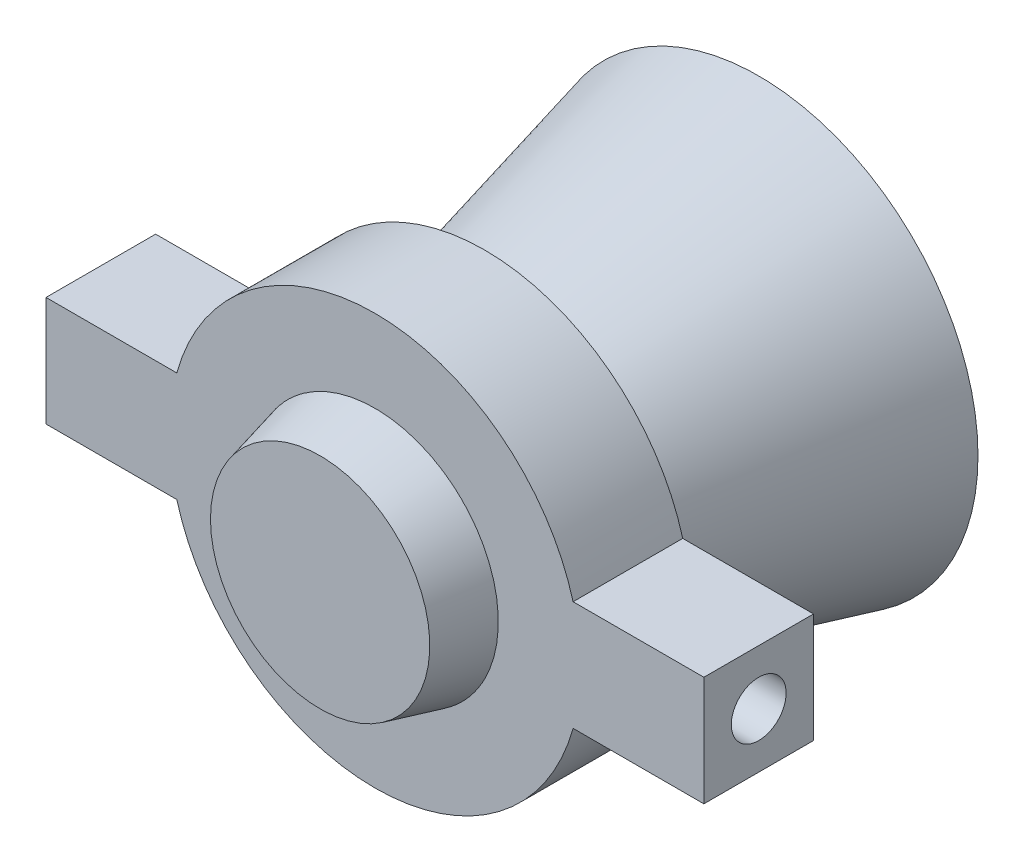
ISO-10303-21;
HEADER;
FILE_DESCRIPTION(('STEP AP214'),'2;1');
FILE_NAME('part.step','',(''),(''),'','','');
FILE_SCHEMA(('AUTOMOTIVE_DESIGN { 1 0 10303 214 1 1 1 1 }'));
ENDSEC;
DATA;
#1=APPLICATION_CONTEXT('core data for automotive mechanical design processes');
#2=APPLICATION_PROTOCOL_DEFINITION('international standard','automotive_design',2000,#1);
#3=PRODUCT_CONTEXT('',#1,'mechanical');
#4=PRODUCT('Part','Part','',(#3));
#5=PRODUCT_RELATED_PRODUCT_CATEGORY('part','',(#4));
#6=PRODUCT_DEFINITION_FORMATION('','',#4);
#7=PRODUCT_DEFINITION_CONTEXT('part definition',#1,'design');
#8=PRODUCT_DEFINITION('design','',#6,#7);
#9=PRODUCT_DEFINITION_SHAPE('','',#8);
#10=(LENGTH_UNIT() NAMED_UNIT(*) SI_UNIT(.MILLI.,.METRE.));
#11=(NAMED_UNIT(*) PLANE_ANGLE_UNIT() SI_UNIT($,.RADIAN.));
#12=(NAMED_UNIT(*) SI_UNIT($,.STERADIAN.) SOLID_ANGLE_UNIT());
#13=UNCERTAINTY_MEASURE_WITH_UNIT(LENGTH_MEASURE(1.E-05),#10,'distance_accuracy_value','');
#14=(GEOMETRIC_REPRESENTATION_CONTEXT(3) GLOBAL_UNCERTAINTY_ASSIGNED_CONTEXT((#13)) GLOBAL_UNIT_ASSIGNED_CONTEXT((#10,
#11,#12)) REPRESENTATION_CONTEXT('',''));
#15=CARTESIAN_POINT('',(0.,0.,0.));
#16=DIRECTION('',(0.,0.,1.));
#17=DIRECTION('',(1.,0.,0.));
#18=AXIS2_PLACEMENT_3D('',#15,#16,#17);
#19=CARTESIAN_POINT('',(0.,0.,0.));
#20=DIRECTION('',(0.,0.,-1.));
#21=DIRECTION('',(-1.,0.,0.));
#22=AXIS2_PLACEMENT_3D('',#19,#20,#21);
#23=CYLINDRICAL_SURFACE('',#22,23.8125);
#24=CARTESIAN_POINT('',(0.,0.,44.45));
#25=DIRECTION('',(0.,0.,-1.));
#26=DIRECTION('',(-1.,0.,0.));
#27=AXIS2_PLACEMENT_3D('',#24,#25,#26);
#28=CIRCLE('',#27,23.8125);
#29=CARTESIAN_POINT('',(22.9502212679965,-6.35,44.45));
#30=VERTEX_POINT('',#29);
#31=CARTESIAN_POINT('',(-22.9502212679965,-6.35,44.45));
#32=VERTEX_POINT('',#31);
#33=EDGE_CURVE('E12',#30,#32,#28,.T.);
#34=ORIENTED_EDGE('',*,*,#33,.T.);
#35=DIRECTION('',(0.,0.,-1.));
#36=VECTOR('',#35,1.);
#37=CARTESIAN_POINT('',(-22.9502212679965,-6.35,0.));
#38=LINE('',#37,#36);
#39=CARTESIAN_POINT('',(-22.9502212679965,-6.35,31.75));
#40=VERTEX_POINT('',#39);
#41=EDGE_CURVE('E112',#32,#40,#38,.T.);
#42=ORIENTED_EDGE('',*,*,#41,.T.);
#43=CARTESIAN_POINT('',(0.,0.,31.75));
#44=DIRECTION('',(0.,0.,-1.));
#45=DIRECTION('',(-1.,0.,0.));
#46=AXIS2_PLACEMENT_3D('',#43,#44,#45);
#47=CIRCLE('',#46,23.8125);
#48=CARTESIAN_POINT('',(22.9502212679965,-6.35,31.75));
#49=VERTEX_POINT('',#48);
#50=EDGE_CURVE('E121',#49,#40,#47,.T.);
#51=ORIENTED_EDGE('',*,*,#50,.F.);
#52=DIRECTION('',(0.,0.,-1.));
#53=VECTOR('',#52,1.);
#54=CARTESIAN_POINT('',(22.9502212679965,-6.35,0.));
#55=LINE('',#54,#53);
#56=EDGE_CURVE('E66',#30,#49,#55,.T.);
#57=ORIENTED_EDGE('',*,*,#56,.F.);
#58=EDGE_LOOP('',(#34,#42,#51,#57));
#59=FACE_BOUND('',#58,.T.);
#60=ADVANCED_FACE('F50',(#59),#23,.T.);
#61=CARTESIAN_POINT('',(-22.9502212679965,6.35,31.75));
#62=VERTEX_POINT('',#61);
#63=CARTESIAN_POINT('',(22.9502212679965,6.35,31.75));
#64=VERTEX_POINT('',#63);
#65=EDGE_CURVE('E135',#62,#64,#47,.T.);
#66=ORIENTED_EDGE('',*,*,#65,.F.);
#67=DIRECTION('',(0.,0.,-1.));
#68=VECTOR('',#67,1.);
#69=CARTESIAN_POINT('',(-22.9502212679965,6.35,0.));
#70=LINE('',#69,#68);
#71=CARTESIAN_POINT('',(-22.9502212679965,6.35,44.45));
#72=VERTEX_POINT('',#71);
#73=EDGE_CURVE('E123',#62,#72,#70,.F.);
#74=ORIENTED_EDGE('',*,*,#73,.T.);
#75=CARTESIAN_POINT('',(22.9502212679965,6.35,44.45));
#76=VERTEX_POINT('',#75);
#77=EDGE_CURVE('E54',#72,#76,#28,.T.);
#78=ORIENTED_EDGE('',*,*,#77,.T.);
#79=DIRECTION('',(0.,0.,-1.));
#80=VECTOR('',#79,1.);
#81=CARTESIAN_POINT('',(22.9502212679965,6.35,0.));
#82=LINE('',#81,#80);
#83=EDGE_CURVE('E147',#64,#76,#82,.F.);
#84=ORIENTED_EDGE('',*,*,#83,.F.);
#85=EDGE_LOOP('',(#66,#74,#78,#84));
#86=FACE_BOUND('',#85,.T.);
#87=ADVANCED_FACE('F198',(#86),#23,.T.);
#88=CARTESIAN_POINT('',(0.,-23.8125,44.45));
#89=DIRECTION('',(0.,0.,-1.));
#90=DIRECTION('',(-1.,0.,0.));
#91=AXIS2_PLACEMENT_3D('',#88,#89,#90);
#92=PLANE('',#91);
#93=ORIENTED_EDGE('',*,*,#33,.F.);
#94=DIRECTION('',(1.,0.,0.));
#95=VECTOR('',#94,1.);
#96=CARTESIAN_POINT('',(-25.401,-6.35,44.45));
#97=LINE('',#96,#95);
#98=CARTESIAN_POINT('',(38.1,-6.35,44.45));
#99=VERTEX_POINT('',#98);
#100=EDGE_CURVE('E150',#30,#99,#97,.T.);
#101=ORIENTED_EDGE('',*,*,#100,.T.);
#102=DIRECTION('',(0.,-1.,0.));
#103=VECTOR('',#102,1.);
#104=CARTESIAN_POINT('',(38.1,-6.35,44.45));
#105=LINE('',#104,#103);
#106=CARTESIAN_POINT('',(38.1,6.35,44.45));
#107=VERTEX_POINT('',#106);
#108=EDGE_CURVE('E138',#107,#99,#105,.T.);
#109=ORIENTED_EDGE('',*,*,#108,.F.);
#110=DIRECTION('',(1.,0.,0.));
#111=VECTOR('',#110,1.);
#112=CARTESIAN_POINT('',(-25.401,6.35,44.45));
#113=LINE('',#112,#111);
#114=EDGE_CURVE('E144',#76,#107,#113,.T.);
#115=ORIENTED_EDGE('',*,*,#114,.F.);
#116=ORIENTED_EDGE('',*,*,#77,.F.);
#117=DIRECTION('',(-1.,0.,0.));
#118=VECTOR('',#117,1.);
#119=CARTESIAN_POINT('',(38.101,6.35,44.45));
#120=LINE('',#119,#118);
#121=CARTESIAN_POINT('',(-38.1,6.35,44.45));
#122=VERTEX_POINT('',#121);
#123=EDGE_CURVE('E65',#72,#122,#120,.T.);
#124=ORIENTED_EDGE('',*,*,#123,.T.);
#125=DIRECTION('',(0.,-1.,0.));
#126=VECTOR('',#125,1.);
#127=CARTESIAN_POINT('',(-38.1,-6.35,44.45));
#128=LINE('',#127,#126);
#129=CARTESIAN_POINT('',(-38.1,-6.35,44.45));
#130=VERTEX_POINT('',#129);
#131=EDGE_CURVE('E127',#122,#130,#128,.T.);
#132=ORIENTED_EDGE('',*,*,#131,.T.);
#133=DIRECTION('',(-1.,0.,0.));
#134=VECTOR('',#133,1.);
#135=CARTESIAN_POINT('',(38.101,-6.35,44.45));
#136=LINE('',#135,#134);
#137=EDGE_CURVE('E167',#32,#130,#136,.T.);
#138=ORIENTED_EDGE('',*,*,#137,.F.);
#139=EDGE_LOOP('',(#93,#101,#109,#115,#116,#124,#132,#138));
#140=FACE_BOUND('',#139,.T.);
#141=CARTESIAN_POINT('',(0.,0.,44.45));
#142=DIRECTION('',(0.,0.,-1.));
#143=DIRECTION('',(-1.,0.,0.));
#144=AXIS2_PLACEMENT_3D('',#141,#142,#143);
#145=CIRCLE('',#144,14.2875);
#146=CARTESIAN_POINT('',(-14.2875,0.,44.45));
#147=VERTEX_POINT('',#146);
#148=EDGE_CURVE('E140',#147,#147,#145,.T.);
#149=ORIENTED_EDGE('',*,*,#148,.T.);
#150=EDGE_LOOP('',(#149));
#151=FACE_BOUND('',#150,.T.);
#152=ADVANCED_FACE('F47',(#140,#151),#92,.F.);
#153=CARTESIAN_POINT('',(0.,-17.4625,31.75));
#154=DIRECTION('',(0.,0.,1.));
#155=DIRECTION('',(1.,0.,0.));
#156=AXIS2_PLACEMENT_3D('',#153,#154,#155);
#157=PLANE('',#156);
#158=CARTESIAN_POINT('',(0.,0.,31.75));
#159=DIRECTION('',(0.,0.,-1.));
#160=DIRECTION('',(-1.,0.,0.));
#161=AXIS2_PLACEMENT_3D('',#158,#159,#160);
#162=CIRCLE('',#161,17.4625);
#163=CARTESIAN_POINT('',(-17.4625,0.,31.75));
#164=VERTEX_POINT('',#163);
#165=EDGE_CURVE('E134',#164,#164,#162,.T.);
#166=ORIENTED_EDGE('',*,*,#165,.F.);
#167=EDGE_LOOP('',(#166));
#168=FACE_BOUND('',#167,.T.);
#169=ORIENTED_EDGE('',*,*,#50,.T.);
#170=DIRECTION('',(-1.,0.,0.));
#171=VECTOR('',#170,1.);
#172=CARTESIAN_POINT('',(38.101,-6.35,31.75));
#173=LINE('',#172,#171);
#174=CARTESIAN_POINT('',(-38.1,-6.35,31.75));
#175=VERTEX_POINT('',#174);
#176=EDGE_CURVE('E111',#40,#175,#173,.T.);
#177=ORIENTED_EDGE('',*,*,#176,.T.);
#178=DIRECTION('',(0.,1.,0.));
#179=VECTOR('',#178,1.);
#180=CARTESIAN_POINT('',(-38.1,-6.35,31.75));
#181=LINE('',#180,#179);
#182=CARTESIAN_POINT('',(-38.1,6.35,31.75));
#183=VERTEX_POINT('',#182);
#184=EDGE_CURVE('E125',#175,#183,#181,.T.);
#185=ORIENTED_EDGE('',*,*,#184,.T.);
#186=DIRECTION('',(-1.,0.,0.));
#187=VECTOR('',#186,1.);
#188=CARTESIAN_POINT('',(38.101,6.35,31.75));
#189=LINE('',#188,#187);
#190=EDGE_CURVE('E174',#62,#183,#189,.T.);
#191=ORIENTED_EDGE('',*,*,#190,.F.);
#192=ORIENTED_EDGE('',*,*,#65,.T.);
#193=DIRECTION('',(1.,0.,0.));
#194=VECTOR('',#193,1.);
#195=CARTESIAN_POINT('',(-25.401,6.35,31.75));
#196=LINE('',#195,#194);
#197=CARTESIAN_POINT('',(38.1,6.35,31.75));
#198=VERTEX_POINT('',#197);
#199=EDGE_CURVE('E142',#64,#198,#196,.T.);
#200=ORIENTED_EDGE('',*,*,#199,.T.);
#201=DIRECTION('',(0.,1.,0.));
#202=VECTOR('',#201,1.);
#203=CARTESIAN_POINT('',(38.1,-6.35,31.75));
#204=LINE('',#203,#202);
#205=CARTESIAN_POINT('',(38.1,-6.35,31.75));
#206=VERTEX_POINT('',#205);
#207=EDGE_CURVE('E157',#206,#198,#204,.T.);
#208=ORIENTED_EDGE('',*,*,#207,.F.);
#209=DIRECTION('',(1.,0.,0.));
#210=VECTOR('',#209,1.);
#211=CARTESIAN_POINT('',(-25.401,-6.35,31.75));
#212=LINE('',#211,#210);
#213=EDGE_CURVE('E132',#49,#206,#212,.T.);
#214=ORIENTED_EDGE('',*,*,#213,.F.);
#215=EDGE_LOOP('',(#169,#177,#185,#191,#192,#200,#208,#214));
#216=FACE_BOUND('',#215,.T.);
#217=ADVANCED_FACE('F126',(#168,#216),#157,.F.);
#218=CARTESIAN_POINT('',(0.,0.,31.75));
#219=DIRECTION('',(0.,0.,-1.));
#220=DIRECTION('',(-1.,0.,0.));
#221=AXIS2_PLACEMENT_3D('',#218,#219,#220);
#222=CONICAL_SURFACE('',#221,17.4625,0.244978663126864);
#223=ORIENTED_EDGE('',*,*,#148,.F.);
#224=EDGE_LOOP('',(#223));
#225=FACE_BOUND('',#224,.T.);
#226=ORIENTED_EDGE('',*,*,#165,.T.);
#227=EDGE_LOOP('',(#226));
#228=FACE_BOUND('',#227,.T.);
#229=ADVANCED_FACE('F209',(#225,#228),#222,.F.);
#230=CARTESIAN_POINT('',(-25.401,-6.35,44.45));
#231=DIRECTION('',(0.,-1.,0.));
#232=DIRECTION('',(0.,0.,-1.));
#233=AXIS2_PLACEMENT_3D('',#230,#231,#232);
#234=PLANE('',#233);
#235=ORIENTED_EDGE('',*,*,#100,.F.);
#236=ORIENTED_EDGE('',*,*,#56,.T.);
#237=ORIENTED_EDGE('',*,*,#213,.T.);
#238=DIRECTION('',(0.,0.,-1.));
#239=VECTOR('',#238,1.);
#240=CARTESIAN_POINT('',(38.1,-6.35,44.45));
#241=LINE('',#240,#239);
#242=EDGE_CURVE('E141',#99,#206,#241,.T.);
#243=ORIENTED_EDGE('',*,*,#242,.F.);
#244=EDGE_LOOP('',(#235,#236,#237,#243));
#245=FACE_BOUND('',#244,.T.);
#246=ADVANCED_FACE('F214',(#245),#234,.T.);
#247=CARTESIAN_POINT('',(-25.401,6.35,44.45));
#248=DIRECTION('',(0.,1.,0.));
#249=DIRECTION('',(0.,0.,1.));
#250=AXIS2_PLACEMENT_3D('',#247,#248,#249);
#251=PLANE('',#250);
#252=ORIENTED_EDGE('',*,*,#199,.F.);
#253=ORIENTED_EDGE('',*,*,#83,.T.);
#254=ORIENTED_EDGE('',*,*,#114,.T.);
#255=DIRECTION('',(0.,0.,1.));
#256=VECTOR('',#255,1.);
#257=CARTESIAN_POINT('',(38.1,6.35,44.45));
#258=LINE('',#257,#256);
#259=EDGE_CURVE('E156',#198,#107,#258,.T.);
#260=ORIENTED_EDGE('',*,*,#259,.F.);
#261=EDGE_LOOP('',(#252,#253,#254,#260));
#262=FACE_BOUND('',#261,.T.);
#263=ADVANCED_FACE('F220',(#262),#251,.T.);
#264=CARTESIAN_POINT('',(38.1,0.,0.));
#265=DIRECTION('',(1.,0.,0.));
#266=DIRECTION('',(0.,0.,-1.));
#267=AXIS2_PLACEMENT_3D('',#264,#265,#266);
#268=PLANE('',#267);
#269=CARTESIAN_POINT('',(38.1,0.,38.1));
#270=DIRECTION('',(1.,0.,0.));
#271=DIRECTION('',(0.,0.,-1.));
#272=AXIS2_PLACEMENT_3D('',#269,#270,#271);
#273=CIRCLE('',#272,3.175);
#274=CARTESIAN_POINT('',(38.1,0.,34.925));
#275=VERTEX_POINT('',#274);
#276=EDGE_CURVE('E165',#275,#275,#273,.T.);
#277=ORIENTED_EDGE('',*,*,#276,.F.);
#278=EDGE_LOOP('',(#277));
#279=FACE_BOUND('',#278,.T.);
#280=ORIENTED_EDGE('',*,*,#242,.T.);
#281=ORIENTED_EDGE('',*,*,#207,.T.);
#282=ORIENTED_EDGE('',*,*,#259,.T.);
#283=ORIENTED_EDGE('',*,*,#108,.T.);
#284=EDGE_LOOP('',(#280,#281,#282,#283));
#285=FACE_BOUND('',#284,.T.);
#286=ADVANCED_FACE('F222',(#279,#285),#268,.T.);
#287=CARTESIAN_POINT('',(19.05,0.,38.1));
#288=DIRECTION('',(1.,0.,0.));
#289=DIRECTION('',(0.,0.,-1.));
#290=AXIS2_PLACEMENT_3D('',#287,#288,#289);
#291=CYLINDRICAL_SURFACE('',#290,3.175);
#292=CARTESIAN_POINT('',(19.05,0.,38.1));
#293=DIRECTION('',(1.,0.,0.));
#294=DIRECTION('',(0.,0.,-1.));
#295=AXIS2_PLACEMENT_3D('',#292,#293,#294);
#296=CIRCLE('',#295,3.175);
#297=CARTESIAN_POINT('',(19.05,0.,34.925));
#298=VERTEX_POINT('',#297);
#299=EDGE_CURVE('E154',#298,#298,#296,.T.);
#300=CARTESIAN_POINT('',(19.05,0.,34.925));
#301=CARTESIAN_POINT('',(19.2484375,0.,34.925));
#302=CARTESIAN_POINT('',(19.446875,0.,34.925));
#303=CARTESIAN_POINT('',(19.84375,0.,34.925));
#304=CARTESIAN_POINT('',(20.0421875,0.,34.925));
#305=CARTESIAN_POINT('',(20.4390625,0.,34.925));
#306=CARTESIAN_POINT('',(20.6375,0.,34.925));
#307=CARTESIAN_POINT('',(21.034375,0.,34.925));
#308=CARTESIAN_POINT('',(21.2328125,0.,34.925));
#309=CARTESIAN_POINT('',(21.6296875,0.,34.925));
#310=CARTESIAN_POINT('',(21.828125,0.,34.925));
#311=CARTESIAN_POINT('',(22.225,0.,34.925));
#312=CARTESIAN_POINT('',(22.4234375,0.,34.925));
#313=CARTESIAN_POINT('',(22.8203125,0.,34.925));
#314=CARTESIAN_POINT('',(23.01875,0.,34.925));
#315=CARTESIAN_POINT('',(23.415625,0.,34.925));
#316=CARTESIAN_POINT('',(23.6140625,0.,34.925));
#317=CARTESIAN_POINT('',(24.0109375,0.,34.925));
#318=CARTESIAN_POINT('',(24.209375,0.,34.925));
#319=CARTESIAN_POINT('',(24.60625,0.,34.925));
#320=CARTESIAN_POINT('',(24.8046875,0.,34.925));
#321=CARTESIAN_POINT('',(25.2015625,0.,34.925));
#322=CARTESIAN_POINT('',(25.4,0.,34.925));
#323=CARTESIAN_POINT('',(25.796875,0.,34.925));
#324=CARTESIAN_POINT('',(25.9953125,0.,34.925));
#325=CARTESIAN_POINT('',(26.3921875,0.,34.925));
#326=CARTESIAN_POINT('',(26.590625,0.,34.925));
#327=CARTESIAN_POINT('',(26.9875,0.,34.925));
#328=CARTESIAN_POINT('',(27.1859375,0.,34.925));
#329=CARTESIAN_POINT('',(27.5828125,0.,34.925));
#330=CARTESIAN_POINT('',(27.78125,0.,34.925));
#331=CARTESIAN_POINT('',(28.178125,0.,34.925));
#332=CARTESIAN_POINT('',(28.3765625,0.,34.925));
#333=CARTESIAN_POINT('',(28.7734375,0.,34.925));
#334=CARTESIAN_POINT('',(28.971875,0.,34.925));
#335=CARTESIAN_POINT('',(29.36875,0.,34.925));
#336=CARTESIAN_POINT('',(29.5671875,0.,34.925));
#337=CARTESIAN_POINT('',(29.9640625,0.,34.925));
#338=CARTESIAN_POINT('',(30.1625,0.,34.925));
#339=CARTESIAN_POINT('',(30.559375,0.,34.925));
#340=CARTESIAN_POINT('',(30.7578125,0.,34.925));
#341=CARTESIAN_POINT('',(31.1546875,0.,34.925));
#342=CARTESIAN_POINT('',(31.353125,0.,34.925));
#343=CARTESIAN_POINT('',(31.75,0.,34.925));
#344=CARTESIAN_POINT('',(31.9484375,0.,34.925));
#345=CARTESIAN_POINT('',(32.3453125,0.,34.925));
#346=CARTESIAN_POINT('',(32.54375,0.,34.925));
#347=CARTESIAN_POINT('',(32.940625,0.,34.925));
#348=CARTESIAN_POINT('',(33.1390625,0.,34.925));
#349=CARTESIAN_POINT('',(33.5359375,0.,34.925));
#350=CARTESIAN_POINT('',(33.734375,0.,34.925));
#351=CARTESIAN_POINT('',(34.13125,0.,34.925));
#352=CARTESIAN_POINT('',(34.3296875,0.,34.925));
#353=CARTESIAN_POINT('',(34.7265625,0.,34.925));
#354=CARTESIAN_POINT('',(34.925,0.,34.925));
#355=CARTESIAN_POINT('',(35.321875,0.,34.925));
#356=CARTESIAN_POINT('',(35.5203125,0.,34.925));
#357=CARTESIAN_POINT('',(35.9171875,0.,34.925));
#358=CARTESIAN_POINT('',(36.115625,0.,34.925));
#359=CARTESIAN_POINT('',(36.5125,0.,34.925));
#360=CARTESIAN_POINT('',(36.7109375,0.,34.925));
#361=CARTESIAN_POINT('',(37.1078125,0.,34.925));
#362=CARTESIAN_POINT('',(37.30625,0.,34.925));
#363=CARTESIAN_POINT('',(37.703125,0.,34.925));
#364=CARTESIAN_POINT('',(37.9015625,0.,34.925));
#365=CARTESIAN_POINT('',(38.1,0.,34.925));
#366=B_SPLINE_CURVE_WITH_KNOTS('',3,(#300,#301,#302,#303,#304,#305,#306,#307,#308,#309,#310,
#311,#312,#313,#314,#315,#316,#317,#318,#319,#320,#321,#322,#323,#324,#325,#326,#327,#328,#329,
#330,#331,#332,#333,#334,#335,#336,#337,#338,#339,#340,#341,#342,#343,#344,#345,#346,#347,#348,
#349,#350,#351,#352,#353,#354,#355,#356,#357,#358,#359,#360,#361,#362,#363,#364,#365),
.UNSPECIFIED.,.F.,.F.,(4,2,2,2,2,2,2,2,2,2,2,2,2,2,2,2,2,2,2,2,2,2,2,2,2,2,2,2,2,2,2,2,4),(0.,
0.5953125,1.190625,1.7859375,2.38125,2.9765625,3.571875,4.1671875,4.7625,5.3578125,5.953125,
6.5484375,7.14375,7.7390625,8.334375,8.92968750000001,9.52500000000001,10.1203125,10.715625,
11.3109375,11.90625,12.5015625,13.096875,13.6921875,14.2875,14.8828125,15.478125,16.0734375,
16.66875,17.2640625,17.859375,18.4546875,19.05),.UNSPECIFIED.);
#367=EDGE_CURVE('BSEAM223',#298,#275,#366,.T.);
#368=ORIENTED_EDGE('',*,*,#299,.F.);
#369=ORIENTED_EDGE('',*,*,#276,.T.);
#370=ORIENTED_EDGE('',*,*,#367,.T.);
#371=ORIENTED_EDGE('',*,*,#367,.F.);
#372=EDGE_LOOP('',(#368,#370,#369,#371));
#373=FACE_BOUND('',#372,.T.);
#374=ADVANCED_FACE('F223',(#373),#291,.F.);
#375=CARTESIAN_POINT('',(19.05,0.,38.1));
#376=DIRECTION('',(1.,0.,0.));
#377=DIRECTION('',(0.,0.,-1.));
#378=AXIS2_PLACEMENT_3D('',#375,#376,#377);
#379=PLANE('',#378);
#380=ORIENTED_EDGE('',*,*,#299,.T.);
#381=EDGE_LOOP('',(#380));
#382=FACE_BOUND('',#381,.T.);
#383=ADVANCED_FACE('F230',(#382),#379,.T.);
#384=CARTESIAN_POINT('',(38.101,-6.35,44.45));
#385=DIRECTION('',(0.,1.,0.));
#386=DIRECTION('',(0.,0.,1.));
#387=AXIS2_PLACEMENT_3D('',#384,#385,#386);
#388=PLANE('',#387);
#389=ORIENTED_EDGE('',*,*,#41,.F.);
#390=ORIENTED_EDGE('',*,*,#137,.T.);
#391=DIRECTION('',(0.,0.,-1.));
#392=VECTOR('',#391,1.);
#393=CARTESIAN_POINT('',(-38.1,-6.35,44.45));
#394=LINE('',#393,#392);
#395=EDGE_CURVE('E120',#130,#175,#394,.T.);
#396=ORIENTED_EDGE('',*,*,#395,.T.);
#397=ORIENTED_EDGE('',*,*,#176,.F.);
#398=EDGE_LOOP('',(#389,#390,#396,#397));
#399=FACE_BOUND('',#398,.T.);
#400=ADVANCED_FACE('F113',(#399),#388,.F.);
#401=CARTESIAN_POINT('',(38.101,6.35,44.45));
#402=DIRECTION('',(0.,-1.,0.));
#403=DIRECTION('',(0.,0.,-1.));
#404=AXIS2_PLACEMENT_3D('',#401,#402,#403);
#405=PLANE('',#404);
#406=ORIENTED_EDGE('',*,*,#73,.F.);
#407=ORIENTED_EDGE('',*,*,#190,.T.);
#408=DIRECTION('',(0.,0.,1.));
#409=VECTOR('',#408,1.);
#410=CARTESIAN_POINT('',(-38.1,6.35,44.45));
#411=LINE('',#410,#409);
#412=EDGE_CURVE('E172',#183,#122,#411,.T.);
#413=ORIENTED_EDGE('',*,*,#412,.T.);
#414=ORIENTED_EDGE('',*,*,#123,.F.);
#415=EDGE_LOOP('',(#406,#407,#413,#414));
#416=FACE_BOUND('',#415,.T.);
#417=ADVANCED_FACE('F232',(#416),#405,.F.);
#418=CARTESIAN_POINT('',(-38.1,0.,0.));
#419=DIRECTION('',(-1.,0.,0.));
#420=DIRECTION('',(0.,0.,-1.));
#421=AXIS2_PLACEMENT_3D('',#418,#419,#420);
#422=PLANE('',#421);
#423=CARTESIAN_POINT('',(-38.1,0.,38.1));
#424=DIRECTION('',(1.,0.,0.));
#425=DIRECTION('',(0.,0.,-1.));
#426=AXIS2_PLACEMENT_3D('',#423,#424,#425);
#427=CIRCLE('',#426,3.175);
#428=CARTESIAN_POINT('',(-38.1,0.,41.275));
#429=VERTEX_POINT('',#428);
#430=EDGE_CURVE('E185',#429,#429,#427,.T.);
#431=ORIENTED_EDGE('',*,*,#430,.T.);
#432=EDGE_LOOP('',(#431));
#433=FACE_BOUND('',#432,.T.);
#434=ORIENTED_EDGE('',*,*,#395,.F.);
#435=ORIENTED_EDGE('',*,*,#131,.F.);
#436=ORIENTED_EDGE('',*,*,#412,.F.);
#437=ORIENTED_EDGE('',*,*,#184,.F.);
#438=EDGE_LOOP('',(#434,#435,#436,#437));
#439=FACE_BOUND('',#438,.T.);
#440=ADVANCED_FACE('F200',(#433,#439),#422,.T.);
#441=CARTESIAN_POINT('',(-19.05,0.,38.1));
#442=DIRECTION('',(-1.,0.,0.));
#443=DIRECTION('',(0.,0.,1.));
#444=AXIS2_PLACEMENT_3D('',#441,#442,#443);
#445=CYLINDRICAL_SURFACE('',#444,3.175);
#446=CARTESIAN_POINT('',(-19.05,0.,38.1));
#447=DIRECTION('',(1.,0.,0.));
#448=DIRECTION('',(0.,0.,-1.));
#449=AXIS2_PLACEMENT_3D('',#446,#447,#448);
#450=CIRCLE('',#449,3.175);
#451=CARTESIAN_POINT('',(-19.05,0.,41.275));
#452=VERTEX_POINT('',#451);
#453=EDGE_CURVE('E175',#452,#452,#450,.T.);
#454=CARTESIAN_POINT('',(-19.05,0.,41.275));
#455=CARTESIAN_POINT('',(-19.2484375,0.,41.275));
#456=CARTESIAN_POINT('',(-19.446875,0.,41.275));
#457=CARTESIAN_POINT('',(-19.84375,0.,41.275));
#458=CARTESIAN_POINT('',(-20.0421875,0.,41.275));
#459=CARTESIAN_POINT('',(-20.4390625,0.,41.275));
#460=CARTESIAN_POINT('',(-20.6375,0.,41.275));
#461=CARTESIAN_POINT('',(-21.034375,0.,41.275));
#462=CARTESIAN_POINT('',(-21.2328125,0.,41.275));
#463=CARTESIAN_POINT('',(-21.6296875,0.,41.275));
#464=CARTESIAN_POINT('',(-21.828125,0.,41.275));
#465=CARTESIAN_POINT('',(-22.225,0.,41.275));
#466=CARTESIAN_POINT('',(-22.4234375,0.,41.275));
#467=CARTESIAN_POINT('',(-22.8203125,0.,41.275));
#468=CARTESIAN_POINT('',(-23.01875,0.,41.275));
#469=CARTESIAN_POINT('',(-23.415625,0.,41.275));
#470=CARTESIAN_POINT('',(-23.6140625,0.,41.275));
#471=CARTESIAN_POINT('',(-24.0109375,0.,41.275));
#472=CARTESIAN_POINT('',(-24.209375,0.,41.275));
#473=CARTESIAN_POINT('',(-24.60625,0.,41.275));
#474=CARTESIAN_POINT('',(-24.8046875,0.,41.275));
#475=CARTESIAN_POINT('',(-25.2015625,0.,41.275));
#476=CARTESIAN_POINT('',(-25.4,0.,41.275));
#477=CARTESIAN_POINT('',(-25.796875,0.,41.275));
#478=CARTESIAN_POINT('',(-25.9953125,0.,41.275));
#479=CARTESIAN_POINT('',(-26.3921875,0.,41.275));
#480=CARTESIAN_POINT('',(-26.590625,0.,41.275));
#481=CARTESIAN_POINT('',(-26.9875,0.,41.275));
#482=CARTESIAN_POINT('',(-27.1859375,0.,41.275));
#483=CARTESIAN_POINT('',(-27.5828125,0.,41.275));
#484=CARTESIAN_POINT('',(-27.78125,0.,41.275));
#485=CARTESIAN_POINT('',(-28.178125,0.,41.275));
#486=CARTESIAN_POINT('',(-28.3765625,0.,41.275));
#487=CARTESIAN_POINT('',(-28.7734375,0.,41.275));
#488=CARTESIAN_POINT('',(-28.971875,0.,41.275));
#489=CARTESIAN_POINT('',(-29.36875,0.,41.275));
#490=CARTESIAN_POINT('',(-29.5671875,0.,41.275));
#491=CARTESIAN_POINT('',(-29.9640625,0.,41.275));
#492=CARTESIAN_POINT('',(-30.1625,0.,41.275));
#493=CARTESIAN_POINT('',(-30.559375,0.,41.275));
#494=CARTESIAN_POINT('',(-30.7578125,0.,41.275));
#495=CARTESIAN_POINT('',(-31.1546875,0.,41.275));
#496=CARTESIAN_POINT('',(-31.353125,0.,41.275));
#497=CARTESIAN_POINT('',(-31.75,0.,41.275));
#498=CARTESIAN_POINT('',(-31.9484375,0.,41.275));
#499=CARTESIAN_POINT('',(-32.3453125,0.,41.275));
#500=CARTESIAN_POINT('',(-32.54375,0.,41.275));
#501=CARTESIAN_POINT('',(-32.940625,0.,41.275));
#502=CARTESIAN_POINT('',(-33.1390625,0.,41.275));
#503=CARTESIAN_POINT('',(-33.5359375,0.,41.275));
#504=CARTESIAN_POINT('',(-33.734375,0.,41.275));
#505=CARTESIAN_POINT('',(-34.13125,0.,41.275));
#506=CARTESIAN_POINT('',(-34.3296875,0.,41.275));
#507=CARTESIAN_POINT('',(-34.7265625,0.,41.275));
#508=CARTESIAN_POINT('',(-34.925,0.,41.275));
#509=CARTESIAN_POINT('',(-35.321875,0.,41.275));
#510=CARTESIAN_POINT('',(-35.5203125,0.,41.275));
#511=CARTESIAN_POINT('',(-35.9171875,0.,41.275));
#512=CARTESIAN_POINT('',(-36.115625,0.,41.275));
#513=CARTESIAN_POINT('',(-36.5125,0.,41.275));
#514=CARTESIAN_POINT('',(-36.7109375,0.,41.275));
#515=CARTESIAN_POINT('',(-37.1078125,0.,41.275));
#516=CARTESIAN_POINT('',(-37.30625,0.,41.275));
#517=CARTESIAN_POINT('',(-37.703125,0.,41.275));
#518=CARTESIAN_POINT('',(-37.9015625,0.,41.275));
#519=CARTESIAN_POINT('',(-38.1,0.,41.275));
#520=B_SPLINE_CURVE_WITH_KNOTS('',3,(#454,#455,#456,#457,#458,#459,#460,#461,#462,#463,#464,
#465,#466,#467,#468,#469,#470,#471,#472,#473,#474,#475,#476,#477,#478,#479,#480,#481,#482,#483,
#484,#485,#486,#487,#488,#489,#490,#491,#492,#493,#494,#495,#496,#497,#498,#499,#500,#501,#502,
#503,#504,#505,#506,#507,#508,#509,#510,#511,#512,#513,#514,#515,#516,#517,#518,#519),
.UNSPECIFIED.,.F.,.F.,(4,2,2,2,2,2,2,2,2,2,2,2,2,2,2,2,2,2,2,2,2,2,2,2,2,2,2,2,2,2,2,2,4),(0.,
0.595312499999997,1.190625,1.7859375,2.38125,2.9765625,3.571875,4.1671875,4.7625,5.3578125,
5.953125,6.5484375,7.14375,7.7390625,8.334375,8.9296875,9.525,10.1203125,10.715625,11.3109375,
11.90625,12.5015625,13.096875,13.6921875,14.2875,14.8828125,15.478125,16.0734375,16.66875,
17.2640625,17.859375,18.4546875,19.05),.UNSPECIFIED.);
#521=EDGE_CURVE('BSEAM189',#452,#429,#520,.T.);
#522=ORIENTED_EDGE('',*,*,#453,.T.);
#523=ORIENTED_EDGE('',*,*,#430,.F.);
#524=ORIENTED_EDGE('',*,*,#521,.T.);
#525=ORIENTED_EDGE('',*,*,#521,.F.);
#526=EDGE_LOOP('',(#522,#524,#523,#525));
#527=FACE_BOUND('',#526,.T.);
#528=ADVANCED_FACE('F189',(#527),#445,.F.);
#529=CARTESIAN_POINT('',(-19.05,0.,38.1));
#530=DIRECTION('',(-1.,0.,0.));
#531=DIRECTION('',(0.,0.,-1.));
#532=AXIS2_PLACEMENT_3D('',#529,#530,#531);
#533=PLANE('',#532);
#534=ORIENTED_EDGE('',*,*,#453,.F.);
#535=EDGE_LOOP('',(#534));
#536=FACE_BOUND('',#535,.T.);
#537=ADVANCED_FACE('F192',(#536),#533,.T.);
#538=CLOSED_SHELL('',(#60,#87,#152,#217,#229,#246,#263,#286,#374,#383,#400,#417,#440,#528,#537));
#539=MANIFOLD_SOLID_BREP('B2',#538);
#540=CARTESIAN_POINT('',(0.,0.,50.8));
#541=DIRECTION('',(0.,0.,-1.));
#542=DIRECTION('',(-1.,0.,0.));
#543=AXIS2_PLACEMENT_3D('',#540,#541,#542);
#544=PLANE('',#543);
#545=CARTESIAN_POINT('',(0.,0.,50.8));
#546=DIRECTION('',(0.,0.,-1.));
#547=DIRECTION('',(-1.,0.,0.));
#548=AXIS2_PLACEMENT_3D('',#545,#546,#547);
#549=CIRCLE('',#548,12.7);
#550=CARTESIAN_POINT('',(-12.7,0.,50.8));
#551=VERTEX_POINT('',#550);
#552=EDGE_CURVE('E46',#551,#551,#549,.T.);
#553=ORIENTED_EDGE('',*,*,#552,.F.);
#554=EDGE_LOOP('',(#553));
#555=FACE_BOUND('',#554,.T.);
#556=ADVANCED_FACE('F362',(#555),#544,.F.);
#557=CARTESIAN_POINT('',(0.,0.,50.8));
#558=DIRECTION('',(0.,0.,-1.));
#559=DIRECTION('',(-1.,0.,0.));
#560=AXIS2_PLACEMENT_3D('',#557,#558,#559);
#561=CONICAL_SURFACE('',#560,12.7,0.244978663126864);
#562=CARTESIAN_POINT('',(0.,0.,0.));
#563=DIRECTION('',(0.,0.,-1.));
#564=DIRECTION('',(-1.,0.,0.));
#565=AXIS2_PLACEMENT_3D('',#562,#563,#564);
#566=CIRCLE('',#565,25.4);
#567=CARTESIAN_POINT('',(-25.4,0.,0.));
#568=VERTEX_POINT('',#567);
#569=EDGE_CURVE('E371',#568,#568,#566,.T.);
#570=ORIENTED_EDGE('',*,*,#569,.F.);
#571=EDGE_LOOP('',(#570));
#572=FACE_BOUND('',#571,.T.);
#573=ORIENTED_EDGE('',*,*,#552,.T.);
#574=EDGE_LOOP('',(#573));
#575=FACE_BOUND('',#574,.T.);
#576=ADVANCED_FACE('F378',(#572,#575),#561,.T.);
#577=CARTESIAN_POINT('',(0.,-25.4,0.));
#578=DIRECTION('',(0.,0.,1.));
#579=DIRECTION('',(1.,0.,0.));
#580=AXIS2_PLACEMENT_3D('',#577,#578,#579);
#581=PLANE('',#580);
#582=ORIENTED_EDGE('',*,*,#569,.T.);
#583=EDGE_LOOP('',(#582));
#584=FACE_BOUND('',#583,.T.);
#585=ADVANCED_FACE('F380',(#584),#581,.F.);
#586=CLOSED_SHELL('',(#556,#576,#585));
#587=MANIFOLD_SOLID_BREP('B6',#586);
#588=ADVANCED_BREP_SHAPE_REPRESENTATION('',(#18,#539,#587),#14);
#589=SHAPE_DEFINITION_REPRESENTATION(#9,#588);
ENDSEC;
END-ISO-10303-21;
